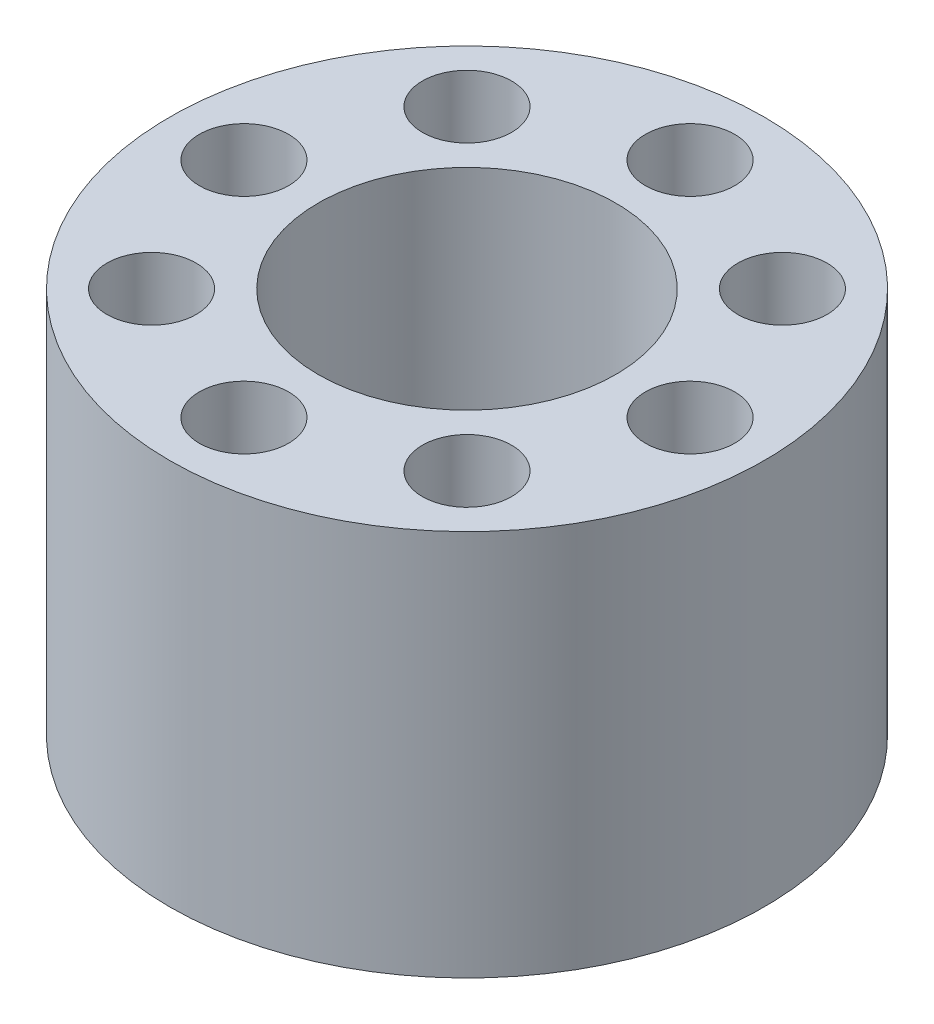
ISO-10303-21;
HEADER;
FILE_DESCRIPTION(('STEP AP214'),'2;1');
FILE_NAME('part.step','',(''),(''),'','','');
FILE_SCHEMA(('AUTOMOTIVE_DESIGN { 1 0 10303 214 1 1 1 1 }'));
ENDSEC;
DATA;
#1=APPLICATION_CONTEXT('core data for automotive mechanical design processes');
#2=APPLICATION_PROTOCOL_DEFINITION('international standard','automotive_design',2000,#1);
#3=PRODUCT_CONTEXT('',#1,'mechanical');
#4=PRODUCT('Part','Part','',(#3));
#5=PRODUCT_RELATED_PRODUCT_CATEGORY('part','',(#4));
#6=PRODUCT_DEFINITION_FORMATION('','',#4);
#7=PRODUCT_DEFINITION_CONTEXT('part definition',#1,'design');
#8=PRODUCT_DEFINITION('design','',#6,#7);
#9=PRODUCT_DEFINITION_SHAPE('','',#8);
#10=(LENGTH_UNIT() NAMED_UNIT(*) SI_UNIT(.MILLI.,.METRE.));
#11=(NAMED_UNIT(*) PLANE_ANGLE_UNIT() SI_UNIT($,.RADIAN.));
#12=(NAMED_UNIT(*) SI_UNIT($,.STERADIAN.) SOLID_ANGLE_UNIT());
#13=UNCERTAINTY_MEASURE_WITH_UNIT(LENGTH_MEASURE(1.E-05),#10,'distance_accuracy_value','');
#14=(GEOMETRIC_REPRESENTATION_CONTEXT(3) GLOBAL_UNCERTAINTY_ASSIGNED_CONTEXT((#13)) GLOBAL_UNIT_ASSIGNED_CONTEXT((#10,
#11,#12)) REPRESENTATION_CONTEXT('',''));
#15=CARTESIAN_POINT('',(0.,0.,0.));
#16=DIRECTION('',(0.,0.,1.));
#17=DIRECTION('',(1.,0.,0.));
#18=AXIS2_PLACEMENT_3D('',#15,#16,#17);
#19=CARTESIAN_POINT('',(0.,11.6325558949903,0.));
#20=DIRECTION('',(0.,1.,0.));
#21=DIRECTION('',(0.,0.,1.));
#22=AXIS2_PLACEMENT_3D('',#19,#20,#21);
#23=CYLINDRICAL_SURFACE('',#22,10.);
#24=CARTESIAN_POINT('',(0.,13.,0.));
#25=DIRECTION('',(0.,1.,0.));
#26=DIRECTION('',(0.,0.,1.));
#27=AXIS2_PLACEMENT_3D('',#24,#25,#26);
#28=CIRCLE('',#27,10.);
#29=CARTESIAN_POINT('',(0.,13.,10.));
#30=VERTEX_POINT('',#29);
#31=EDGE_CURVE('E10',#30,#30,#28,.T.);
#32=ORIENTED_EDGE('',*,*,#31,.F.);
#33=EDGE_LOOP('',(#32));
#34=FACE_BOUND('',#33,.T.);
#35=CARTESIAN_POINT('',(0.,0.,0.));
#36=DIRECTION('',(0.,1.,0.));
#37=DIRECTION('',(0.,0.,1.));
#38=AXIS2_PLACEMENT_3D('',#35,#36,#37);
#39=CIRCLE('',#38,10.);
#40=CARTESIAN_POINT('',(0.,0.,10.));
#41=VERTEX_POINT('',#40);
#42=EDGE_CURVE('E53',#41,#41,#39,.T.);
#43=ORIENTED_EDGE('',*,*,#42,.T.);
#44=EDGE_LOOP('',(#43));
#45=FACE_BOUND('',#44,.T.);
#46=ADVANCED_FACE('F39',(#34,#45),#23,.T.);
#47=CARTESIAN_POINT('',(10.,13.,0.));
#48=DIRECTION('',(0.,-1.,0.));
#49=DIRECTION('',(0.,0.,-1.));
#50=AXIS2_PLACEMENT_3D('',#47,#48,#49);
#51=PLANE('',#50);
#52=CARTESIAN_POINT('',(-5.30330085889911,13.,-5.30330085889911));
#53=DIRECTION('',(0.,1.,0.));
#54=DIRECTION('',(0.,0.,1.));
#55=AXIS2_PLACEMENT_3D('',#52,#53,#54);
#56=CIRCLE('',#55,1.5);
#57=CARTESIAN_POINT('',(-5.30330085889911,13.,-3.80330085889911));
#58=VERTEX_POINT('',#57);
#59=EDGE_CURVE('E65',#58,#58,#56,.T.);
#60=ORIENTED_EDGE('',*,*,#59,.F.);
#61=EDGE_LOOP('',(#60));
#62=FACE_BOUND('',#61,.T.);
#63=CARTESIAN_POINT('',(-7.5,13.,0.));
#64=DIRECTION('',(0.,1.,0.));
#65=DIRECTION('',(0.,0.,1.));
#66=AXIS2_PLACEMENT_3D('',#63,#64,#65);
#67=CIRCLE('',#66,1.5);
#68=CARTESIAN_POINT('',(-7.5,13.,1.5));
#69=VERTEX_POINT('',#68);
#70=EDGE_CURVE('E71',#69,#69,#67,.T.);
#71=ORIENTED_EDGE('',*,*,#70,.F.);
#72=EDGE_LOOP('',(#71));
#73=FACE_BOUND('',#72,.T.);
#74=CARTESIAN_POINT('',(-5.30330085889911,13.,5.30330085889911));
#75=DIRECTION('',(0.,1.,0.));
#76=DIRECTION('',(0.,0.,1.));
#77=AXIS2_PLACEMENT_3D('',#74,#75,#76);
#78=CIRCLE('',#77,1.5);
#79=CARTESIAN_POINT('',(-5.30330085889911,13.,6.80330085889911));
#80=VERTEX_POINT('',#79);
#81=EDGE_CURVE('E77',#80,#80,#78,.T.);
#82=ORIENTED_EDGE('',*,*,#81,.F.);
#83=EDGE_LOOP('',(#82));
#84=FACE_BOUND('',#83,.T.);
#85=CARTESIAN_POINT('',(0.,13.,7.5));
#86=DIRECTION('',(0.,1.,0.));
#87=DIRECTION('',(0.,0.,1.));
#88=AXIS2_PLACEMENT_3D('',#85,#86,#87);
#89=CIRCLE('',#88,1.5);
#90=CARTESIAN_POINT('',(0.,13.,9.));
#91=VERTEX_POINT('',#90);
#92=EDGE_CURVE('E83',#91,#91,#89,.T.);
#93=ORIENTED_EDGE('',*,*,#92,.F.);
#94=EDGE_LOOP('',(#93));
#95=FACE_BOUND('',#94,.T.);
#96=CARTESIAN_POINT('',(5.30330085889911,13.,5.30330085889911));
#97=DIRECTION('',(0.,1.,0.));
#98=DIRECTION('',(0.,0.,1.));
#99=AXIS2_PLACEMENT_3D('',#96,#97,#98);
#100=CIRCLE('',#99,1.5);
#101=CARTESIAN_POINT('',(5.30330085889911,13.,6.80330085889911));
#102=VERTEX_POINT('',#101);
#103=EDGE_CURVE('E89',#102,#102,#100,.T.);
#104=ORIENTED_EDGE('',*,*,#103,.F.);
#105=EDGE_LOOP('',(#104));
#106=FACE_BOUND('',#105,.T.);
#107=CARTESIAN_POINT('',(7.5,13.,0.));
#108=DIRECTION('',(0.,1.,0.));
#109=DIRECTION('',(0.,0.,1.));
#110=AXIS2_PLACEMENT_3D('',#107,#108,#109);
#111=CIRCLE('',#110,1.5);
#112=CARTESIAN_POINT('',(7.5,13.,1.5));
#113=VERTEX_POINT('',#112);
#114=EDGE_CURVE('E95',#113,#113,#111,.T.);
#115=ORIENTED_EDGE('',*,*,#114,.F.);
#116=EDGE_LOOP('',(#115));
#117=FACE_BOUND('',#116,.T.);
#118=CARTESIAN_POINT('',(5.30330085889911,13.,-5.30330085889911));
#119=DIRECTION('',(0.,1.,0.));
#120=DIRECTION('',(0.,0.,1.));
#121=AXIS2_PLACEMENT_3D('',#118,#119,#120);
#122=CIRCLE('',#121,1.5);
#123=CARTESIAN_POINT('',(5.30330085889911,13.,-3.80330085889911));
#124=VERTEX_POINT('',#123);
#125=EDGE_CURVE('E101',#124,#124,#122,.T.);
#126=ORIENTED_EDGE('',*,*,#125,.F.);
#127=EDGE_LOOP('',(#126));
#128=FACE_BOUND('',#127,.T.);
#129=CARTESIAN_POINT('',(0.,13.,-7.5));
#130=DIRECTION('',(0.,1.,0.));
#131=DIRECTION('',(0.,0.,1.));
#132=AXIS2_PLACEMENT_3D('',#129,#130,#131);
#133=CIRCLE('',#132,1.5);
#134=CARTESIAN_POINT('',(0.,13.,-6.));
#135=VERTEX_POINT('',#134);
#136=EDGE_CURVE('E59',#135,#135,#133,.T.);
#137=ORIENTED_EDGE('',*,*,#136,.F.);
#138=EDGE_LOOP('',(#137));
#139=FACE_BOUND('',#138,.T.);
#140=CARTESIAN_POINT('',(0.,13.,0.));
#141=DIRECTION('',(0.,1.,0.));
#142=DIRECTION('',(0.,0.,1.));
#143=AXIS2_PLACEMENT_3D('',#140,#141,#142);
#144=CIRCLE('',#143,5.);
#145=CARTESIAN_POINT('',(0.,13.,5.));
#146=VERTEX_POINT('',#145);
#147=EDGE_CURVE('E45',#146,#146,#144,.T.);
#148=ORIENTED_EDGE('',*,*,#147,.F.);
#149=EDGE_LOOP('',(#148));
#150=FACE_BOUND('',#149,.T.);
#151=ORIENTED_EDGE('',*,*,#31,.T.);
#152=EDGE_LOOP('',(#151));
#153=FACE_BOUND('',#152,.T.);
#154=ADVANCED_FACE('F118',(#62,#73,#84,#95,#106,#117,#128,#139,#150,#153),#51,.F.);
#155=CARTESIAN_POINT('',(0.,11.6325558949903,0.));
#156=DIRECTION('',(0.,1.,0.));
#157=DIRECTION('',(0.,0.,1.));
#158=AXIS2_PLACEMENT_3D('',#155,#156,#157);
#159=CYLINDRICAL_SURFACE('',#158,5.);
#160=CARTESIAN_POINT('',(0.,0.,0.));
#161=DIRECTION('',(0.,1.,0.));
#162=DIRECTION('',(0.,0.,1.));
#163=AXIS2_PLACEMENT_3D('',#160,#161,#162);
#164=CIRCLE('',#163,5.);
#165=CARTESIAN_POINT('',(0.,0.,5.));
#166=VERTEX_POINT('',#165);
#167=EDGE_CURVE('E49',#166,#166,#164,.T.);
#168=ORIENTED_EDGE('',*,*,#167,.F.);
#169=EDGE_LOOP('',(#168));
#170=FACE_BOUND('',#169,.T.);
#171=ORIENTED_EDGE('',*,*,#147,.T.);
#172=EDGE_LOOP('',(#171));
#173=FACE_BOUND('',#172,.T.);
#174=ADVANCED_FACE('F121',(#170,#173),#159,.F.);
#175=CARTESIAN_POINT('',(10.,0.,0.));
#176=DIRECTION('',(0.,1.,0.));
#177=DIRECTION('',(0.,0.,1.));
#178=AXIS2_PLACEMENT_3D('',#175,#176,#177);
#179=PLANE('',#178);
#180=CARTESIAN_POINT('',(-5.30330085889911,0.,-5.30330085889911));
#181=DIRECTION('',(0.,1.,0.));
#182=DIRECTION('',(0.,0.,1.));
#183=AXIS2_PLACEMENT_3D('',#180,#181,#182);
#184=CIRCLE('',#183,1.5);
#185=CARTESIAN_POINT('',(-5.30330085889911,0.,-3.80330085889911));
#186=VERTEX_POINT('',#185);
#187=EDGE_CURVE('E68',#186,#186,#184,.T.);
#188=ORIENTED_EDGE('',*,*,#187,.T.);
#189=EDGE_LOOP('',(#188));
#190=FACE_BOUND('',#189,.T.);
#191=CARTESIAN_POINT('',(-7.5,0.,0.));
#192=DIRECTION('',(0.,1.,0.));
#193=DIRECTION('',(0.,0.,1.));
#194=AXIS2_PLACEMENT_3D('',#191,#192,#193);
#195=CIRCLE('',#194,1.5);
#196=CARTESIAN_POINT('',(-7.5,0.,1.5));
#197=VERTEX_POINT('',#196);
#198=EDGE_CURVE('E74',#197,#197,#195,.T.);
#199=ORIENTED_EDGE('',*,*,#198,.T.);
#200=EDGE_LOOP('',(#199));
#201=FACE_BOUND('',#200,.T.);
#202=CARTESIAN_POINT('',(-5.30330085889911,0.,5.30330085889911));
#203=DIRECTION('',(0.,1.,0.));
#204=DIRECTION('',(0.,0.,1.));
#205=AXIS2_PLACEMENT_3D('',#202,#203,#204);
#206=CIRCLE('',#205,1.5);
#207=CARTESIAN_POINT('',(-5.30330085889911,0.,6.80330085889911));
#208=VERTEX_POINT('',#207);
#209=EDGE_CURVE('E80',#208,#208,#206,.T.);
#210=ORIENTED_EDGE('',*,*,#209,.T.);
#211=EDGE_LOOP('',(#210));
#212=FACE_BOUND('',#211,.T.);
#213=CARTESIAN_POINT('',(0.,0.,7.5));
#214=DIRECTION('',(0.,1.,0.));
#215=DIRECTION('',(0.,0.,1.));
#216=AXIS2_PLACEMENT_3D('',#213,#214,#215);
#217=CIRCLE('',#216,1.5);
#218=CARTESIAN_POINT('',(0.,0.,9.));
#219=VERTEX_POINT('',#218);
#220=EDGE_CURVE('E86',#219,#219,#217,.T.);
#221=ORIENTED_EDGE('',*,*,#220,.T.);
#222=EDGE_LOOP('',(#221));
#223=FACE_BOUND('',#222,.T.);
#224=CARTESIAN_POINT('',(5.30330085889911,0.,5.30330085889911));
#225=DIRECTION('',(0.,1.,0.));
#226=DIRECTION('',(0.,0.,1.));
#227=AXIS2_PLACEMENT_3D('',#224,#225,#226);
#228=CIRCLE('',#227,1.5);
#229=CARTESIAN_POINT('',(5.30330085889911,0.,6.80330085889911));
#230=VERTEX_POINT('',#229);
#231=EDGE_CURVE('E92',#230,#230,#228,.T.);
#232=ORIENTED_EDGE('',*,*,#231,.T.);
#233=EDGE_LOOP('',(#232));
#234=FACE_BOUND('',#233,.T.);
#235=CARTESIAN_POINT('',(7.5,0.,0.));
#236=DIRECTION('',(0.,1.,0.));
#237=DIRECTION('',(0.,0.,1.));
#238=AXIS2_PLACEMENT_3D('',#235,#236,#237);
#239=CIRCLE('',#238,1.5);
#240=CARTESIAN_POINT('',(7.5,0.,1.5));
#241=VERTEX_POINT('',#240);
#242=EDGE_CURVE('E98',#241,#241,#239,.T.);
#243=ORIENTED_EDGE('',*,*,#242,.T.);
#244=EDGE_LOOP('',(#243));
#245=FACE_BOUND('',#244,.T.);
#246=CARTESIAN_POINT('',(5.30330085889911,0.,-5.30330085889911));
#247=DIRECTION('',(0.,1.,0.));
#248=DIRECTION('',(0.,0.,1.));
#249=AXIS2_PLACEMENT_3D('',#246,#247,#248);
#250=CIRCLE('',#249,1.5);
#251=CARTESIAN_POINT('',(5.30330085889911,0.,-3.80330085889911));
#252=VERTEX_POINT('',#251);
#253=EDGE_CURVE('E62',#252,#252,#250,.T.);
#254=ORIENTED_EDGE('',*,*,#253,.T.);
#255=EDGE_LOOP('',(#254));
#256=FACE_BOUND('',#255,.T.);
#257=CARTESIAN_POINT('',(0.,0.,-7.5));
#258=DIRECTION('',(0.,1.,0.));
#259=DIRECTION('',(0.,0.,1.));
#260=AXIS2_PLACEMENT_3D('',#257,#258,#259);
#261=CIRCLE('',#260,1.5);
#262=CARTESIAN_POINT('',(0.,0.,-6.));
#263=VERTEX_POINT('',#262);
#264=EDGE_CURVE('E58',#263,#263,#261,.T.);
#265=ORIENTED_EDGE('',*,*,#264,.T.);
#266=EDGE_LOOP('',(#265));
#267=FACE_BOUND('',#266,.T.);
#268=ORIENTED_EDGE('',*,*,#42,.F.);
#269=EDGE_LOOP('',(#268));
#270=FACE_BOUND('',#269,.T.);
#271=ORIENTED_EDGE('',*,*,#167,.T.);
#272=EDGE_LOOP('',(#271));
#273=FACE_BOUND('',#272,.T.);
#274=ADVANCED_FACE('F107',(#190,#201,#212,#223,#234,#245,#256,#267,#270,#273),#179,.F.);
#275=CARTESIAN_POINT('',(0.,0.,-7.5));
#276=DIRECTION('',(0.,1.,0.));
#277=DIRECTION('',(0.,0.,1.));
#278=AXIS2_PLACEMENT_3D('',#275,#276,#277);
#279=CYLINDRICAL_SURFACE('',#278,1.5);
#280=ORIENTED_EDGE('',*,*,#264,.F.);
#281=EDGE_LOOP('',(#280));
#282=FACE_BOUND('',#281,.T.);
#283=ORIENTED_EDGE('',*,*,#136,.T.);
#284=EDGE_LOOP('',(#283));
#285=FACE_BOUND('',#284,.T.);
#286=ADVANCED_FACE('F114',(#282,#285),#279,.F.);
#287=CARTESIAN_POINT('',(5.30330085889911,0.,-5.30330085889911));
#288=DIRECTION('',(0.,1.,0.));
#289=DIRECTION('',(0.,0.,1.));
#290=AXIS2_PLACEMENT_3D('',#287,#288,#289);
#291=CYLINDRICAL_SURFACE('',#290,1.5);
#292=ORIENTED_EDGE('',*,*,#253,.F.);
#293=EDGE_LOOP('',(#292));
#294=FACE_BOUND('',#293,.T.);
#295=ORIENTED_EDGE('',*,*,#125,.T.);
#296=EDGE_LOOP('',(#295));
#297=FACE_BOUND('',#296,.T.);
#298=ADVANCED_FACE('F110',(#294,#297),#291,.F.);
#299=CARTESIAN_POINT('',(7.5,0.,0.));
#300=DIRECTION('',(0.,1.,0.));
#301=DIRECTION('',(0.,0.,1.));
#302=AXIS2_PLACEMENT_3D('',#299,#300,#301);
#303=CYLINDRICAL_SURFACE('',#302,1.5);
#304=ORIENTED_EDGE('',*,*,#242,.F.);
#305=EDGE_LOOP('',(#304));
#306=FACE_BOUND('',#305,.T.);
#307=ORIENTED_EDGE('',*,*,#114,.T.);
#308=EDGE_LOOP('',(#307));
#309=FACE_BOUND('',#308,.T.);
#310=ADVANCED_FACE('F113',(#306,#309),#303,.F.);
#311=CARTESIAN_POINT('',(5.30330085889911,0.,5.30330085889911));
#312=DIRECTION('',(0.,1.,0.));
#313=DIRECTION('',(0.,0.,1.));
#314=AXIS2_PLACEMENT_3D('',#311,#312,#313);
#315=CYLINDRICAL_SURFACE('',#314,1.5);
#316=ORIENTED_EDGE('',*,*,#231,.F.);
#317=EDGE_LOOP('',(#316));
#318=FACE_BOUND('',#317,.T.);
#319=ORIENTED_EDGE('',*,*,#103,.T.);
#320=EDGE_LOOP('',(#319));
#321=FACE_BOUND('',#320,.T.);
#322=ADVANCED_FACE('F171',(#318,#321),#315,.F.);
#323=CARTESIAN_POINT('',(0.,0.,7.5));
#324=DIRECTION('',(0.,1.,0.));
#325=DIRECTION('',(0.,0.,1.));
#326=AXIS2_PLACEMENT_3D('',#323,#324,#325);
#327=CYLINDRICAL_SURFACE('',#326,1.5);
#328=ORIENTED_EDGE('',*,*,#220,.F.);
#329=EDGE_LOOP('',(#328));
#330=FACE_BOUND('',#329,.T.);
#331=ORIENTED_EDGE('',*,*,#92,.T.);
#332=EDGE_LOOP('',(#331));
#333=FACE_BOUND('',#332,.T.);
#334=ADVANCED_FACE('F179',(#330,#333),#327,.F.);
#335=CARTESIAN_POINT('',(-5.30330085889911,0.,5.30330085889911));
#336=DIRECTION('',(0.,1.,0.));
#337=DIRECTION('',(0.,0.,1.));
#338=AXIS2_PLACEMENT_3D('',#335,#336,#337);
#339=CYLINDRICAL_SURFACE('',#338,1.5);
#340=ORIENTED_EDGE('',*,*,#209,.F.);
#341=EDGE_LOOP('',(#340));
#342=FACE_BOUND('',#341,.T.);
#343=ORIENTED_EDGE('',*,*,#81,.T.);
#344=EDGE_LOOP('',(#343));
#345=FACE_BOUND('',#344,.T.);
#346=ADVANCED_FACE('F187',(#342,#345),#339,.F.);
#347=CARTESIAN_POINT('',(-7.5,0.,0.));
#348=DIRECTION('',(0.,1.,0.));
#349=DIRECTION('',(0.,0.,1.));
#350=AXIS2_PLACEMENT_3D('',#347,#348,#349);
#351=CYLINDRICAL_SURFACE('',#350,1.5);
#352=ORIENTED_EDGE('',*,*,#198,.F.);
#353=EDGE_LOOP('',(#352));
#354=FACE_BOUND('',#353,.T.);
#355=ORIENTED_EDGE('',*,*,#70,.T.);
#356=EDGE_LOOP('',(#355));
#357=FACE_BOUND('',#356,.T.);
#358=ADVANCED_FACE('F195',(#354,#357),#351,.F.);
#359=CARTESIAN_POINT('',(-5.30330085889911,0.,-5.30330085889911));
#360=DIRECTION('',(0.,1.,0.));
#361=DIRECTION('',(0.,0.,1.));
#362=AXIS2_PLACEMENT_3D('',#359,#360,#361);
#363=CYLINDRICAL_SURFACE('',#362,1.5);
#364=ORIENTED_EDGE('',*,*,#187,.F.);
#365=EDGE_LOOP('',(#364));
#366=FACE_BOUND('',#365,.T.);
#367=ORIENTED_EDGE('',*,*,#59,.T.);
#368=EDGE_LOOP('',(#367));
#369=FACE_BOUND('',#368,.T.);
#370=ADVANCED_FACE('F203',(#366,#369),#363,.F.);
#371=CLOSED_SHELL('',(#46,#154,#174,#274,#286,#298,#310,#322,#334,#346,#358,#370));
#372=MANIFOLD_SOLID_BREP('B2',#371);
#373=ADVANCED_BREP_SHAPE_REPRESENTATION('',(#18,#372),#14);
#374=SHAPE_DEFINITION_REPRESENTATION(#9,#373);
ENDSEC;
END-ISO-10303-21;
